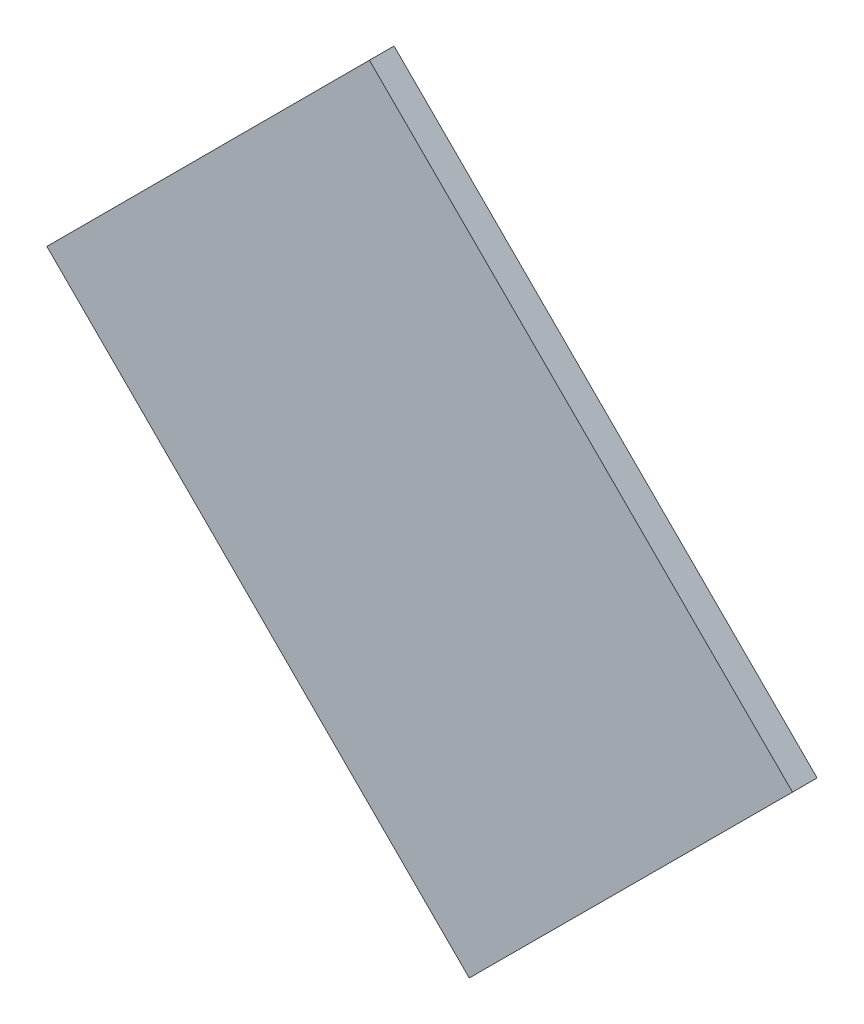
ISO-10303-21;
HEADER;
FILE_DESCRIPTION(('STEP AP214'),'2;1');
FILE_NAME('part.step','',(''),(''),'','','');
FILE_SCHEMA(('AUTOMOTIVE_DESIGN { 1 0 10303 214 1 1 1 1 }'));
ENDSEC;
DATA;
#1=APPLICATION_CONTEXT('core data for automotive mechanical design processes');
#2=APPLICATION_PROTOCOL_DEFINITION('international standard','automotive_design',2000,#1);
#3=PRODUCT_CONTEXT('',#1,'mechanical');
#4=PRODUCT('Part','Part','',(#3));
#5=PRODUCT_RELATED_PRODUCT_CATEGORY('part','',(#4));
#6=PRODUCT_DEFINITION_FORMATION('','',#4);
#7=PRODUCT_DEFINITION_CONTEXT('part definition',#1,'design');
#8=PRODUCT_DEFINITION('design','',#6,#7);
#9=PRODUCT_DEFINITION_SHAPE('','',#8);
#10=(LENGTH_UNIT() NAMED_UNIT(*) SI_UNIT(.MILLI.,.METRE.));
#11=(NAMED_UNIT(*) PLANE_ANGLE_UNIT() SI_UNIT($,.RADIAN.));
#12=(NAMED_UNIT(*) SI_UNIT($,.STERADIAN.) SOLID_ANGLE_UNIT());
#13=UNCERTAINTY_MEASURE_WITH_UNIT(LENGTH_MEASURE(1.E-05),#10,'distance_accuracy_value','');
#14=(GEOMETRIC_REPRESENTATION_CONTEXT(3) GLOBAL_UNCERTAINTY_ASSIGNED_CONTEXT((#13)) GLOBAL_UNIT_ASSIGNED_CONTEXT((#10,
#11,#12)) REPRESENTATION_CONTEXT('',''));
#15=CARTESIAN_POINT('',(0.,0.,0.));
#16=DIRECTION('',(0.,0.,1.));
#17=DIRECTION('',(1.,0.,0.));
#18=AXIS2_PLACEMENT_3D('',#15,#16,#17);
#19=CARTESIAN_POINT('',(854.742,754.318,0.));
#20=DIRECTION('',(0.707106781186548,-0.707106781186548,0.));
#21=DIRECTION('',(-0.707106781186548,-0.707106781186548,0.));
#22=AXIS2_PLACEMENT_3D('',#19,#20,#21);
#23=PLANE('',#22);
#24=DIRECTION('',(-0.707106781186548,-0.707106781186548,0.));
#25=VECTOR('',#24,1.);
#26=CARTESIAN_POINT('',(854.742,754.318,0.0350012));
#27=LINE('',#26,#25);
#28=CARTESIAN_POINT('',(854.742,754.318,0.0350012));
#29=VERTEX_POINT('',#28);
#30=CARTESIAN_POINT('',(854.283,753.859,0.0350012));
#31=VERTEX_POINT('',#30);
#32=EDGE_CURVE('E11',#29,#31,#27,.T.);
#33=ORIENTED_EDGE('',*,*,#32,.F.);
#34=DIRECTION('',(0.,0.,1.));
#35=VECTOR('',#34,1.);
#36=CARTESIAN_POINT('',(854.742,754.318,0.));
#37=LINE('',#36,#35);
#38=CARTESIAN_POINT('',(854.742,754.318,0.));
#39=VERTEX_POINT('',#38);
#40=EDGE_CURVE('E24',#39,#29,#37,.T.);
#41=ORIENTED_EDGE('',*,*,#40,.F.);
#42=DIRECTION('',(-0.707106781186548,-0.707106781186548,0.));
#43=VECTOR('',#42,1.);
#44=CARTESIAN_POINT('',(854.742,754.318,0.));
#45=LINE('',#44,#43);
#46=CARTESIAN_POINT('',(854.283,753.859,0.));
#47=VERTEX_POINT('',#46);
#48=EDGE_CURVE('E75',#39,#47,#45,.T.);
#49=ORIENTED_EDGE('',*,*,#48,.T.);
#50=DIRECTION('',(0.,0.,1.));
#51=VECTOR('',#50,1.);
#52=CARTESIAN_POINT('',(854.283,753.859,0.));
#53=LINE('',#52,#51);
#54=EDGE_CURVE('E37',#47,#31,#53,.T.);
#55=ORIENTED_EDGE('',*,*,#54,.T.);
#56=EDGE_LOOP('',(#33,#41,#49,#55));
#57=FACE_BOUND('',#56,.T.);
#58=ADVANCED_FACE('F17',(#57),#23,.F.);
#59=CARTESIAN_POINT('',(854.283,753.859,0.));
#60=DIRECTION('',(0.707106781186548,0.707106781186548,0.));
#61=DIRECTION('',(0.707106781186548,-0.707106781186548,0.));
#62=AXIS2_PLACEMENT_3D('',#59,#60,#61);
#63=PLANE('',#62);
#64=DIRECTION('',(0.707106781186548,-0.707106781186548,0.));
#65=VECTOR('',#64,1.);
#66=CARTESIAN_POINT('',(854.283,753.859,0.0350012));
#67=LINE('',#66,#65);
#68=CARTESIAN_POINT('',(854.884,753.258,0.0350012));
#69=VERTEX_POINT('',#68);
#70=EDGE_CURVE('E83',#31,#69,#67,.T.);
#71=ORIENTED_EDGE('',*,*,#70,.F.);
#72=ORIENTED_EDGE('',*,*,#54,.F.);
#73=DIRECTION('',(0.707106781186548,-0.707106781186548,0.));
#74=VECTOR('',#73,1.);
#75=CARTESIAN_POINT('',(854.283,753.859,0.));
#76=LINE('',#75,#74);
#77=CARTESIAN_POINT('',(854.884,753.258,0.));
#78=VERTEX_POINT('',#77);
#79=EDGE_CURVE('E81',#47,#78,#76,.T.);
#80=ORIENTED_EDGE('',*,*,#79,.T.);
#81=DIRECTION('',(0.,0.,1.));
#82=VECTOR('',#81,1.);
#83=CARTESIAN_POINT('',(854.884,753.258,0.));
#84=LINE('',#83,#82);
#85=EDGE_CURVE('E67',#78,#69,#84,.T.);
#86=ORIENTED_EDGE('',*,*,#85,.T.);
#87=EDGE_LOOP('',(#71,#72,#80,#86));
#88=FACE_BOUND('',#87,.T.);
#89=ADVANCED_FACE('F89',(#88),#63,.F.);
#90=CARTESIAN_POINT('',(854.884,753.258,0.));
#91=DIRECTION('',(-0.706336932353449,0.707875792772658,0.));
#92=DIRECTION('',(0.707875792772658,0.706336932353449,0.));
#93=AXIS2_PLACEMENT_3D('',#90,#91,#92);
#94=PLANE('',#93);
#95=DIRECTION('',(0.707875792772658,0.706336932353449,0.));
#96=VECTOR('',#95,1.);
#97=CARTESIAN_POINT('',(854.884,753.258,0.0350012));
#98=LINE('',#97,#96);
#99=CARTESIAN_POINT('',(855.344,753.717,0.0350012));
#100=VERTEX_POINT('',#99);
#101=EDGE_CURVE('E71',#69,#100,#98,.T.);
#102=ORIENTED_EDGE('',*,*,#101,.F.);
#103=ORIENTED_EDGE('',*,*,#85,.F.);
#104=DIRECTION('',(0.707875792772658,0.706336932353449,0.));
#105=VECTOR('',#104,1.);
#106=CARTESIAN_POINT('',(854.884,753.258,0.));
#107=LINE('',#106,#105);
#108=CARTESIAN_POINT('',(855.344,753.717,0.));
#109=VERTEX_POINT('',#108);
#110=EDGE_CURVE('E63',#78,#109,#107,.T.);
#111=ORIENTED_EDGE('',*,*,#110,.T.);
#112=DIRECTION('',(0.,0.,1.));
#113=VECTOR('',#112,1.);
#114=CARTESIAN_POINT('',(855.344,753.717,0.));
#115=LINE('',#114,#113);
#116=EDGE_CURVE('E53',#109,#100,#115,.T.);
#117=ORIENTED_EDGE('',*,*,#116,.T.);
#118=EDGE_LOOP('',(#102,#103,#111,#117));
#119=FACE_BOUND('',#118,.T.);
#120=ADVANCED_FACE('F66',(#119),#94,.F.);
#121=CARTESIAN_POINT('',(855.344,753.717,0.));
#122=DIRECTION('',(-0.706518750904012,-0.707694322869016,0.));
#123=DIRECTION('',(-0.707694322869016,0.706518750904012,0.));
#124=AXIS2_PLACEMENT_3D('',#121,#122,#123);
#125=PLANE('',#124);
#126=DIRECTION('',(-0.707694322869016,0.706518750904012,0.));
#127=VECTOR('',#126,1.);
#128=CARTESIAN_POINT('',(855.344,753.717,0.0350012));
#129=LINE('',#128,#127);
#130=EDGE_CURVE('E59',#100,#29,#129,.T.);
#131=ORIENTED_EDGE('',*,*,#130,.F.);
#132=ORIENTED_EDGE('',*,*,#116,.F.);
#133=DIRECTION('',(-0.707694322869016,0.706518750904012,0.));
#134=VECTOR('',#133,1.);
#135=CARTESIAN_POINT('',(855.344,753.717,0.));
#136=LINE('',#135,#134);
#137=EDGE_CURVE('E57',#109,#39,#136,.T.);
#138=ORIENTED_EDGE('',*,*,#137,.T.);
#139=ORIENTED_EDGE('',*,*,#40,.T.);
#140=EDGE_LOOP('',(#131,#132,#138,#139));
#141=FACE_BOUND('',#140,.T.);
#142=ADVANCED_FACE('F55',(#141),#125,.F.);
#143=CARTESIAN_POINT('',(854.813375119991,753.787983246561,0.));
#144=DIRECTION('',(0.,0.,1.));
#145=DIRECTION('',(1.,0.,0.));
#146=AXIS2_PLACEMENT_3D('',#143,#144,#145);
#147=PLANE('',#146);
#148=ORIENTED_EDGE('',*,*,#137,.F.);
#149=ORIENTED_EDGE('',*,*,#110,.F.);
#150=ORIENTED_EDGE('',*,*,#79,.F.);
#151=ORIENTED_EDGE('',*,*,#48,.F.);
#152=EDGE_LOOP('',(#148,#149,#150,#151));
#153=FACE_BOUND('',#152,.T.);
#154=ADVANCED_FACE('F74',(#153),#147,.F.);
#155=CARTESIAN_POINT('',(854.813375119991,753.787983246561,0.0350012));
#156=DIRECTION('',(0.,0.,1.));
#157=DIRECTION('',(1.,0.,0.));
#158=AXIS2_PLACEMENT_3D('',#155,#156,#157);
#159=PLANE('',#158);
#160=ORIENTED_EDGE('',*,*,#32,.T.);
#161=ORIENTED_EDGE('',*,*,#70,.T.);
#162=ORIENTED_EDGE('',*,*,#101,.T.);
#163=ORIENTED_EDGE('',*,*,#130,.T.);
#164=EDGE_LOOP('',(#160,#161,#162,#163));
#165=FACE_BOUND('',#164,.T.);
#166=ADVANCED_FACE('F91',(#165),#159,.T.);
#167=CLOSED_SHELL('',(#58,#89,#120,#142,#154,#166));
#168=MANIFOLD_SOLID_BREP('B1',#167);
#169=ADVANCED_BREP_SHAPE_REPRESENTATION('',(#18,#168),#14);
#170=SHAPE_DEFINITION_REPRESENTATION(#9,#169);
ENDSEC;
END-ISO-10303-21;
